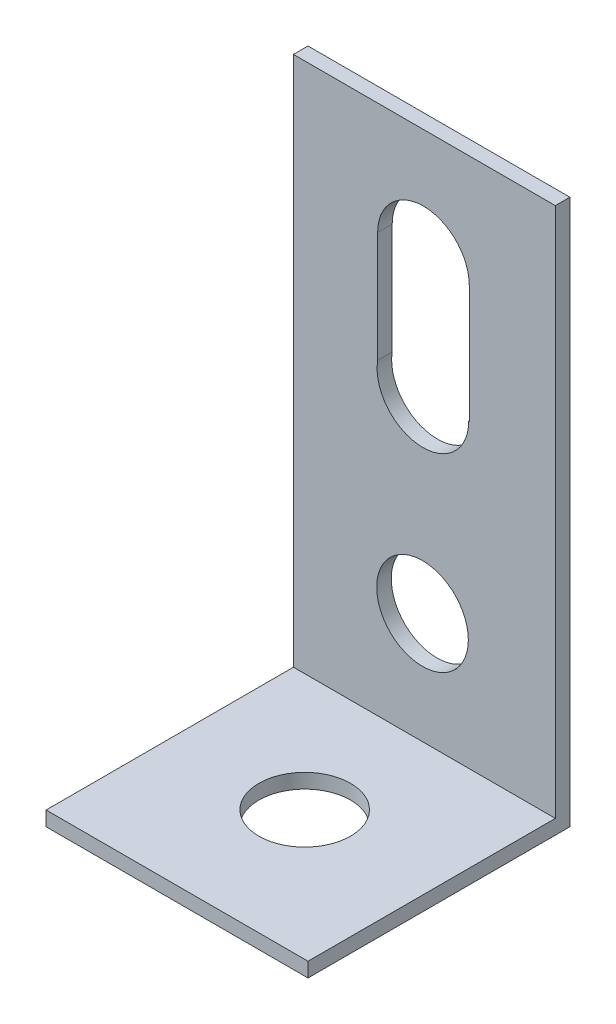
ISO-10303-21;
HEADER;
FILE_DESCRIPTION(('STEP AP214'),'2;1');
FILE_NAME('part.step','',(''),(''),'','','');
FILE_SCHEMA(('AUTOMOTIVE_DESIGN { 1 0 10303 214 1 1 1 1 }'));
ENDSEC;
DATA;
#1=APPLICATION_CONTEXT('core data for automotive mechanical design processes');
#2=APPLICATION_PROTOCOL_DEFINITION('international standard','automotive_design',2000,#1);
#3=PRODUCT_CONTEXT('',#1,'mechanical');
#4=PRODUCT('Part','Part','',(#3));
#5=PRODUCT_RELATED_PRODUCT_CATEGORY('part','',(#4));
#6=PRODUCT_DEFINITION_FORMATION('','',#4);
#7=PRODUCT_DEFINITION_CONTEXT('part definition',#1,'design');
#8=PRODUCT_DEFINITION('design','',#6,#7);
#9=PRODUCT_DEFINITION_SHAPE('','',#8);
#10=(LENGTH_UNIT() NAMED_UNIT(*) SI_UNIT(.MILLI.,.METRE.));
#11=(NAMED_UNIT(*) PLANE_ANGLE_UNIT() SI_UNIT($,.RADIAN.));
#12=(NAMED_UNIT(*) SI_UNIT($,.STERADIAN.) SOLID_ANGLE_UNIT());
#13=UNCERTAINTY_MEASURE_WITH_UNIT(LENGTH_MEASURE(1.E-05),#10,'distance_accuracy_value','');
#14=(GEOMETRIC_REPRESENTATION_CONTEXT(3) GLOBAL_UNCERTAINTY_ASSIGNED_CONTEXT((#13)) GLOBAL_UNIT_ASSIGNED_CONTEXT((#10,
#11,#12)) REPRESENTATION_CONTEXT('',''));
#15=CARTESIAN_POINT('',(0.,0.,0.));
#16=DIRECTION('',(0.,0.,1.));
#17=DIRECTION('',(1.,0.,0.));
#18=AXIS2_PLACEMENT_3D('',#15,#16,#17);
#19=CARTESIAN_POINT('',(24.3486309030817,2.667,23.7425931641171));
#20=DIRECTION('',(-1.,0.,0.));
#21=DIRECTION('',(0.,0.,1.));
#22=AXIS2_PLACEMENT_3D('',#19,#20,#21);
#23=PLANE('',#22);
#24=DIRECTION('',(0.,0.,-1.));
#25=VECTOR('',#24,1.);
#26=CARTESIAN_POINT('',(24.3486309030817,0.,23.7425931641171));
#27=LINE('',#26,#25);
#28=CARTESIAN_POINT('',(24.3486309030817,0.,23.7425931641171));
#29=VERTEX_POINT('',#28);
#30=CARTESIAN_POINT('',(24.3486309030817,0.,-24.2634068358829));
#31=VERTEX_POINT('',#30);
#32=EDGE_CURVE('E191',#29,#31,#27,.T.);
#33=ORIENTED_EDGE('',*,*,#32,.T.);
#34=DIRECTION('',(0.,-1.,0.));
#35=VECTOR('',#34,1.);
#36=CARTESIAN_POINT('',(24.3486309030817,2.667,-24.2634068358829));
#37=LINE('',#36,#35);
#38=CARTESIAN_POINT('',(24.3486309030817,99.9453824938809,-24.2634068358829));
#39=VERTEX_POINT('',#38);
#40=EDGE_CURVE('E11',#39,#31,#37,.T.);
#41=ORIENTED_EDGE('',*,*,#40,.F.);
#42=DIRECTION('',(0.,0.,1.));
#43=VECTOR('',#42,1.);
#44=CARTESIAN_POINT('',(24.3486309030817,99.9453824938809,-24.2634068358829));
#45=LINE('',#44,#43);
#46=CARTESIAN_POINT('',(24.3486309030817,99.9453824938809,-21.5964068358829));
#47=VERTEX_POINT('',#46);
#48=EDGE_CURVE('E177',#39,#47,#45,.T.);
#49=ORIENTED_EDGE('',*,*,#48,.T.);
#50=DIRECTION('',(0.,-1.,0.));
#51=VECTOR('',#50,1.);
#52=CARTESIAN_POINT('',(24.3486309030817,99.9453824938809,-21.5964068358829));
#53=LINE('',#52,#51);
#54=CARTESIAN_POINT('',(24.3486309030817,2.667,-21.5964068358829));
#55=VERTEX_POINT('',#54);
#56=EDGE_CURVE('E183',#47,#55,#53,.T.);
#57=ORIENTED_EDGE('',*,*,#56,.T.);
#58=DIRECTION('',(0.,0.,-1.));
#59=VECTOR('',#58,1.);
#60=CARTESIAN_POINT('',(24.3486309030817,2.667,23.7425931641171));
#61=LINE('',#60,#59);
#62=CARTESIAN_POINT('',(24.3486309030817,2.667,23.7425931641171));
#63=VERTEX_POINT('',#62);
#64=EDGE_CURVE('E192',#63,#55,#61,.T.);
#65=ORIENTED_EDGE('',*,*,#64,.F.);
#66=DIRECTION('',(0.,-1.,0.));
#67=VECTOR('',#66,1.);
#68=CARTESIAN_POINT('',(24.3486309030817,2.667,23.7425931641171));
#69=LINE('',#68,#67);
#70=EDGE_CURVE('E199',#63,#29,#69,.T.);
#71=ORIENTED_EDGE('',*,*,#70,.T.);
#72=EDGE_LOOP('',(#33,#41,#49,#57,#65,#71));
#73=FACE_BOUND('',#72,.T.);
#74=ADVANCED_FACE('F33',(#73),#23,.F.);
#75=CARTESIAN_POINT('',(-23.6573690969183,2.667,-24.2634068358829));
#76=DIRECTION('',(0.,0.,1.));
#77=DIRECTION('',(1.,0.,0.));
#78=AXIS2_PLACEMENT_3D('',#75,#76,#77);
#79=PLANE('',#78);
#80=DIRECTION('',(0.,-1.,0.));
#81=VECTOR('',#80,1.);
#82=CARTESIAN_POINT('',(-8.22665399711947,2.667,-24.2634068358829));
#83=LINE('',#82,#81);
#84=CARTESIAN_POINT('',(-8.22665399711947,79.3789935221233,-24.2634068358829));
#85=VERTEX_POINT('',#84);
#86=CARTESIAN_POINT('',(-8.22665399711947,59.0966838597933,-24.2634068358829));
#87=VERTEX_POINT('',#86);
#88=EDGE_CURVE('E162',#85,#87,#83,.T.);
#89=ORIENTED_EDGE('',*,*,#88,.T.);
#90=CARTESIAN_POINT('',(0.072763374307272,57.8006625270753,-24.2634068358829));
#91=DIRECTION('',(0.,0.,1.));
#92=DIRECTION('',(1.,0.,0.));
#93=AXIS2_PLACEMENT_3D('',#90,#91,#92);
#94=CIRCLE('',#93,8.4);
#95=CARTESIAN_POINT('',(8.47276337430727,57.8006625270753,-24.2634068358829));
#96=VERTEX_POINT('',#95);
#97=EDGE_CURVE('E165',#87,#96,#94,.T.);
#98=ORIENTED_EDGE('',*,*,#97,.T.);
#99=DIRECTION('',(1.,0.,0.));
#100=VECTOR('',#99,1.);
#101=CARTESIAN_POINT('',(-23.6573690969183,57.8006625270753,-24.2634068358829));
#102=LINE('',#101,#100);
#103=CARTESIAN_POINT('',(8.57334600288054,57.8006625270753,-24.2634068358829));
#104=VERTEX_POINT('',#103);
#105=EDGE_CURVE('E156',#96,#104,#102,.T.);
#106=ORIENTED_EDGE('',*,*,#105,.T.);
#107=DIRECTION('',(0.,1.,0.));
#108=VECTOR('',#107,1.);
#109=CARTESIAN_POINT('',(8.57334600288054,2.667,-24.2634068358829));
#110=LINE('',#109,#108);
#111=CARTESIAN_POINT('',(8.57334600288054,79.3789935221233,-24.2634068358829));
#112=VERTEX_POINT('',#111);
#113=EDGE_CURVE('E122',#104,#112,#110,.T.);
#114=ORIENTED_EDGE('',*,*,#113,.T.);
#115=CARTESIAN_POINT('',(0.173346002880533,79.3789935221233,-24.2634068358829));
#116=DIRECTION('',(0.,0.,1.));
#117=DIRECTION('',(1.,0.,0.));
#118=AXIS2_PLACEMENT_3D('',#115,#116,#117);
#119=CIRCLE('',#118,8.40000000000002);
#120=EDGE_CURVE('E159',#112,#85,#119,.T.);
#121=ORIENTED_EDGE('',*,*,#120,.T.);
#122=EDGE_LOOP('',(#89,#98,#106,#114,#121));
#123=FACE_BOUND('',#122,.T.);
#124=CARTESIAN_POINT('',(0.,23.0200154900135,-24.2634068358829));
#125=DIRECTION('',(0.,0.,1.));
#126=DIRECTION('',(1.,0.,0.));
#127=AXIS2_PLACEMENT_3D('',#124,#125,#126);
#128=CIRCLE('',#127,8.4);
#129=CARTESIAN_POINT('',(8.4,23.0200154900135,-24.2634068358829));
#130=VERTEX_POINT('',#129);
#131=EDGE_CURVE('E146',#130,#130,#128,.T.);
#132=ORIENTED_EDGE('',*,*,#131,.T.);
#133=EDGE_LOOP('',(#132));
#134=FACE_BOUND('',#133,.T.);
#135=DIRECTION('',(-1.,0.,0.));
#136=VECTOR('',#135,1.);
#137=CARTESIAN_POINT('',(-23.6573690969183,0.,-24.2634068358829));
#138=LINE('',#137,#136);
#139=CARTESIAN_POINT('',(-23.6573690969183,0.,-24.2634068358829));
#140=VERTEX_POINT('',#139);
#141=EDGE_CURVE('E201',#31,#140,#138,.T.);
#142=ORIENTED_EDGE('',*,*,#141,.T.);
#143=DIRECTION('',(0.,-1.,0.));
#144=VECTOR('',#143,1.);
#145=CARTESIAN_POINT('',(-23.6573690969183,2.667,-24.2634068358829));
#146=LINE('',#145,#144);
#147=CARTESIAN_POINT('',(-23.6573690969183,99.9453824938809,-24.2634068358829));
#148=VERTEX_POINT('',#147);
#149=EDGE_CURVE('E41',#148,#140,#146,.T.);
#150=ORIENTED_EDGE('',*,*,#149,.F.);
#151=DIRECTION('',(1.,0.,0.));
#152=VECTOR('',#151,1.);
#153=CARTESIAN_POINT('',(-23.6573690969183,99.9453824938809,-24.2634068358829));
#154=LINE('',#153,#152);
#155=EDGE_CURVE('E174',#148,#39,#154,.T.);
#156=ORIENTED_EDGE('',*,*,#155,.T.);
#157=ORIENTED_EDGE('',*,*,#40,.T.);
#158=EDGE_LOOP('',(#142,#150,#156,#157));
#159=FACE_BOUND('',#158,.T.);
#160=ADVANCED_FACE('F239',(#123,#134,#159),#79,.F.);
#161=CARTESIAN_POINT('',(-23.6573690969183,2.667,23.7425931641171));
#162=DIRECTION('',(1.,0.,0.));
#163=DIRECTION('',(0.,0.,-1.));
#164=AXIS2_PLACEMENT_3D('',#161,#162,#163);
#165=PLANE('',#164);
#166=DIRECTION('',(0.,0.,1.));
#167=VECTOR('',#166,1.);
#168=CARTESIAN_POINT('',(-23.6573690969183,2.667,23.7425931641171));
#169=LINE('',#168,#167);
#170=CARTESIAN_POINT('',(-23.6573690969183,2.667,-21.5964068358829));
#171=VERTEX_POINT('',#170);
#172=CARTESIAN_POINT('',(-23.6573690969183,2.667,23.7425931641171));
#173=VERTEX_POINT('',#172);
#174=EDGE_CURVE('E194',#171,#173,#169,.T.);
#175=ORIENTED_EDGE('',*,*,#174,.F.);
#176=DIRECTION('',(0.,-1.,0.));
#177=VECTOR('',#176,1.);
#178=CARTESIAN_POINT('',(-23.6573690969183,99.9453824938809,-21.5964068358829));
#179=LINE('',#178,#177);
#180=CARTESIAN_POINT('',(-23.6573690969183,99.9453824938809,-21.5964068358829));
#181=VERTEX_POINT('',#180);
#182=EDGE_CURVE('E184',#181,#171,#179,.T.);
#183=ORIENTED_EDGE('',*,*,#182,.F.);
#184=DIRECTION('',(0.,0.,-1.));
#185=VECTOR('',#184,1.);
#186=CARTESIAN_POINT('',(-23.6573690969183,99.9453824938809,-24.2634068358829));
#187=LINE('',#186,#185);
#188=EDGE_CURVE('E171',#181,#148,#187,.T.);
#189=ORIENTED_EDGE('',*,*,#188,.T.);
#190=ORIENTED_EDGE('',*,*,#149,.T.);
#191=DIRECTION('',(0.,0.,1.));
#192=VECTOR('',#191,1.);
#193=CARTESIAN_POINT('',(-23.6573690969183,0.,23.7425931641171));
#194=LINE('',#193,#192);
#195=CARTESIAN_POINT('',(-23.6573690969183,0.,23.7425931641171));
#196=VERTEX_POINT('',#195);
#197=EDGE_CURVE('E203',#140,#196,#194,.T.);
#198=ORIENTED_EDGE('',*,*,#197,.T.);
#199=DIRECTION('',(0.,-1.,0.));
#200=VECTOR('',#199,1.);
#201=CARTESIAN_POINT('',(-23.6573690969183,2.667,23.7425931641171));
#202=LINE('',#201,#200);
#203=EDGE_CURVE('E208',#173,#196,#202,.T.);
#204=ORIENTED_EDGE('',*,*,#203,.F.);
#205=EDGE_LOOP('',(#175,#183,#189,#190,#198,#204));
#206=FACE_BOUND('',#205,.T.);
#207=ADVANCED_FACE('F215',(#206),#165,.F.);
#208=CARTESIAN_POINT('',(-23.6573690969183,2.667,23.7425931641171));
#209=DIRECTION('',(0.,0.,-1.));
#210=DIRECTION('',(-1.,0.,0.));
#211=AXIS2_PLACEMENT_3D('',#208,#209,#210);
#212=PLANE('',#211);
#213=DIRECTION('',(1.,0.,0.));
#214=VECTOR('',#213,1.);
#215=CARTESIAN_POINT('',(-23.6573690969183,0.,23.7425931641171));
#216=LINE('',#215,#214);
#217=EDGE_CURVE('E195',#196,#29,#216,.T.);
#218=ORIENTED_EDGE('',*,*,#217,.T.);
#219=ORIENTED_EDGE('',*,*,#70,.F.);
#220=DIRECTION('',(1.,0.,0.));
#221=VECTOR('',#220,1.);
#222=CARTESIAN_POINT('',(-23.6573690969183,2.667,23.7425931641171));
#223=LINE('',#222,#221);
#224=EDGE_CURVE('E197',#173,#63,#223,.T.);
#225=ORIENTED_EDGE('',*,*,#224,.F.);
#226=ORIENTED_EDGE('',*,*,#203,.T.);
#227=EDGE_LOOP('',(#218,#219,#225,#226));
#228=FACE_BOUND('',#227,.T.);
#229=ADVANCED_FACE('F227',(#228),#212,.F.);
#230=CARTESIAN_POINT('',(0.,2.667,0.));
#231=DIRECTION('',(0.,-1.,0.));
#232=DIRECTION('',(0.,0.,-1.));
#233=AXIS2_PLACEMENT_3D('',#230,#231,#232);
#234=PLANE('',#233);
#235=CARTESIAN_POINT('',(0.,2.667,0.));
#236=DIRECTION('',(0.,1.,0.));
#237=DIRECTION('',(0.,0.,1.));
#238=AXIS2_PLACEMENT_3D('',#235,#236,#237);
#239=CIRCLE('',#238,8.4);
#240=CARTESIAN_POINT('',(0.,2.667,8.4));
#241=VERTEX_POINT('',#240);
#242=EDGE_CURVE('E168',#241,#241,#239,.T.);
#243=ORIENTED_EDGE('',*,*,#242,.F.);
#244=EDGE_LOOP('',(#243));
#245=FACE_BOUND('',#244,.T.);
#246=ORIENTED_EDGE('',*,*,#64,.T.);
#247=DIRECTION('',(-1.,0.,0.));
#248=VECTOR('',#247,1.);
#249=CARTESIAN_POINT('',(0.,2.667,-21.5964068358829));
#250=LINE('',#249,#248);
#251=EDGE_CURVE('E187',#55,#171,#250,.T.);
#252=ORIENTED_EDGE('',*,*,#251,.T.);
#253=ORIENTED_EDGE('',*,*,#174,.T.);
#254=ORIENTED_EDGE('',*,*,#224,.T.);
#255=EDGE_LOOP('',(#246,#252,#253,#254));
#256=FACE_BOUND('',#255,.T.);
#257=ADVANCED_FACE('F233',(#245,#256),#234,.F.);
#258=CARTESIAN_POINT('',(0.,0.,0.));
#259=DIRECTION('',(0.,-1.,0.));
#260=DIRECTION('',(0.,0.,-1.));
#261=AXIS2_PLACEMENT_3D('',#258,#259,#260);
#262=PLANE('',#261);
#263=CARTESIAN_POINT('',(0.,0.,0.));
#264=DIRECTION('',(0.,-1.,0.));
#265=DIRECTION('',(0.,0.,-1.));
#266=AXIS2_PLACEMENT_3D('',#263,#264,#265);
#267=CIRCLE('',#266,8.4);
#268=CARTESIAN_POINT('',(0.,0.,-8.4));
#269=VERTEX_POINT('',#268);
#270=EDGE_CURVE('E36',#269,#269,#267,.T.);
#271=ORIENTED_EDGE('',*,*,#270,.F.);
#272=EDGE_LOOP('',(#271));
#273=FACE_BOUND('',#272,.T.);
#274=ORIENTED_EDGE('',*,*,#217,.F.);
#275=ORIENTED_EDGE('',*,*,#197,.F.);
#276=ORIENTED_EDGE('',*,*,#141,.F.);
#277=ORIENTED_EDGE('',*,*,#32,.F.);
#278=EDGE_LOOP('',(#274,#275,#276,#277));
#279=FACE_BOUND('',#278,.T.);
#280=ADVANCED_FACE('F223',(#273,#279),#262,.T.);
#281=CARTESIAN_POINT('',(-23.6573690969183,99.9453824938809,-21.5964068358829));
#282=DIRECTION('',(0.,0.,1.));
#283=DIRECTION('',(1.,0.,0.));
#284=AXIS2_PLACEMENT_3D('',#281,#282,#283);
#285=PLANE('',#284);
#286=CARTESIAN_POINT('',(0.072763374307272,57.8006625270753,-21.5964068358829));
#287=DIRECTION('',(0.,0.,1.));
#288=DIRECTION('',(1.,0.,0.));
#289=AXIS2_PLACEMENT_3D('',#286,#287,#288);
#290=CIRCLE('',#289,8.4);
#291=CARTESIAN_POINT('',(-8.22665399711947,59.0966838597933,-21.5964068358829));
#292=VERTEX_POINT('',#291);
#293=CARTESIAN_POINT('',(8.47276337430727,57.8006625270753,-21.5964068358829));
#294=VERTEX_POINT('',#293);
#295=EDGE_CURVE('E56',#292,#294,#290,.T.);
#296=ORIENTED_EDGE('',*,*,#295,.F.);
#297=DIRECTION('',(0.,-1.,0.));
#298=VECTOR('',#297,1.);
#299=CARTESIAN_POINT('',(-8.22665399711947,0.,-21.5964068358829));
#300=LINE('',#299,#298);
#301=CARTESIAN_POINT('',(-8.22665399711947,79.3789935221233,-21.5964068358829));
#302=VERTEX_POINT('',#301);
#303=EDGE_CURVE('E138',#302,#292,#300,.T.);
#304=ORIENTED_EDGE('',*,*,#303,.F.);
#305=CARTESIAN_POINT('',(0.173346002880533,79.3789935221233,-21.5964068358829));
#306=DIRECTION('',(0.,0.,1.));
#307=DIRECTION('',(1.,0.,0.));
#308=AXIS2_PLACEMENT_3D('',#305,#306,#307);
#309=CIRCLE('',#308,8.40000000000002);
#310=CARTESIAN_POINT('',(8.57334600288054,79.3789935221233,-21.5964068358829));
#311=VERTEX_POINT('',#310);
#312=EDGE_CURVE('E136',#311,#302,#309,.T.);
#313=ORIENTED_EDGE('',*,*,#312,.F.);
#314=DIRECTION('',(0.,1.,0.));
#315=VECTOR('',#314,1.);
#316=CARTESIAN_POINT('',(8.57334600288054,0.,-21.5964068358829));
#317=LINE('',#316,#315);
#318=CARTESIAN_POINT('',(8.57334600288054,57.8006625270753,-21.5964068358829));
#319=VERTEX_POINT('',#318);
#320=EDGE_CURVE('E119',#319,#311,#317,.T.);
#321=ORIENTED_EDGE('',*,*,#320,.F.);
#322=DIRECTION('',(1.,0.,0.));
#323=VECTOR('',#322,1.);
#324=CARTESIAN_POINT('',(0.,57.8006625270753,-21.5964068358829));
#325=LINE('',#324,#323);
#326=EDGE_CURVE('E128',#294,#319,#325,.T.);
#327=ORIENTED_EDGE('',*,*,#326,.F.);
#328=EDGE_LOOP('',(#296,#304,#313,#321,#327));
#329=FACE_BOUND('',#328,.T.);
#330=CARTESIAN_POINT('',(0.,23.0200154900135,-21.5964068358829));
#331=DIRECTION('',(0.,0.,1.));
#332=DIRECTION('',(1.,0.,0.));
#333=AXIS2_PLACEMENT_3D('',#330,#331,#332);
#334=CIRCLE('',#333,8.4);
#335=CARTESIAN_POINT('',(8.4,23.0200154900135,-21.5964068358829));
#336=VERTEX_POINT('',#335);
#337=EDGE_CURVE('E151',#336,#336,#334,.T.);
#338=ORIENTED_EDGE('',*,*,#337,.F.);
#339=EDGE_LOOP('',(#338));
#340=FACE_BOUND('',#339,.T.);
#341=ORIENTED_EDGE('',*,*,#251,.F.);
#342=ORIENTED_EDGE('',*,*,#56,.F.);
#343=DIRECTION('',(-1.,0.,0.));
#344=VECTOR('',#343,1.);
#345=CARTESIAN_POINT('',(-23.6573690969183,99.9453824938809,-21.5964068358829));
#346=LINE('',#345,#344);
#347=EDGE_CURVE('E180',#47,#181,#346,.T.);
#348=ORIENTED_EDGE('',*,*,#347,.T.);
#349=ORIENTED_EDGE('',*,*,#182,.T.);
#350=EDGE_LOOP('',(#341,#342,#348,#349));
#351=FACE_BOUND('',#350,.T.);
#352=ADVANCED_FACE('F132',(#329,#340,#351),#285,.T.);
#353=CARTESIAN_POINT('',(0.,99.9453824938809,0.));
#354=DIRECTION('',(0.,1.,0.));
#355=DIRECTION('',(0.,0.,1.));
#356=AXIS2_PLACEMENT_3D('',#353,#354,#355);
#357=PLANE('',#356);
#358=ORIENTED_EDGE('',*,*,#188,.F.);
#359=ORIENTED_EDGE('',*,*,#347,.F.);
#360=ORIENTED_EDGE('',*,*,#48,.F.);
#361=ORIENTED_EDGE('',*,*,#155,.F.);
#362=EDGE_LOOP('',(#358,#359,#360,#361));
#363=FACE_BOUND('',#362,.T.);
#364=ADVANCED_FACE('F237',(#363),#357,.T.);
#365=CARTESIAN_POINT('',(0.,-18.333,0.));
#366=DIRECTION('',(0.,1.,0.));
#367=DIRECTION('',(0.,0.,1.));
#368=AXIS2_PLACEMENT_3D('',#365,#366,#367);
#369=CYLINDRICAL_SURFACE('',#368,8.4);
#370=ORIENTED_EDGE('',*,*,#270,.T.);
#371=EDGE_LOOP('',(#370));
#372=FACE_BOUND('',#371,.T.);
#373=ORIENTED_EDGE('',*,*,#242,.T.);
#374=EDGE_LOOP('',(#373));
#375=FACE_BOUND('',#374,.T.);
#376=ADVANCED_FACE('F261',(#372,#375),#369,.F.);
#377=CARTESIAN_POINT('',(0.,23.0200154900135,-26.9304068358829));
#378=DIRECTION('',(0.,0.,1.));
#379=DIRECTION('',(1.,0.,0.));
#380=AXIS2_PLACEMENT_3D('',#377,#378,#379);
#381=CYLINDRICAL_SURFACE('',#380,8.4);
#382=ORIENTED_EDGE('',*,*,#337,.T.);
#383=EDGE_LOOP('',(#382));
#384=FACE_BOUND('',#383,.T.);
#385=ORIENTED_EDGE('',*,*,#131,.F.);
#386=EDGE_LOOP('',(#385));
#387=FACE_BOUND('',#386,.T.);
#388=ADVANCED_FACE('F264',(#384,#387),#381,.F.);
#389=CARTESIAN_POINT('',(0.072763374307272,57.8006625270753,-26.9304068358829));
#390=DIRECTION('',(0.,0.,1.));
#391=DIRECTION('',(1.,0.,0.));
#392=AXIS2_PLACEMENT_3D('',#389,#390,#391);
#393=CYLINDRICAL_SURFACE('',#392,8.4);
#394=DIRECTION('',(0.,0.,1.));
#395=VECTOR('',#394,1.);
#396=CARTESIAN_POINT('',(-8.22665399711947,59.0966838597933,-26.9304068358829));
#397=LINE('',#396,#395);
#398=EDGE_CURVE('E144',#87,#292,#397,.T.);
#399=ORIENTED_EDGE('',*,*,#398,.T.);
#400=ORIENTED_EDGE('',*,*,#295,.T.);
#401=DIRECTION('',(0.,0.,1.));
#402=VECTOR('',#401,1.);
#403=CARTESIAN_POINT('',(8.47276337430727,57.8006625270753,-26.9304068358829));
#404=LINE('',#403,#402);
#405=EDGE_CURVE('E125',#96,#294,#404,.T.);
#406=ORIENTED_EDGE('',*,*,#405,.F.);
#407=ORIENTED_EDGE('',*,*,#97,.F.);
#408=EDGE_LOOP('',(#399,#400,#406,#407));
#409=FACE_BOUND('',#408,.T.);
#410=ADVANCED_FACE('F268',(#409),#393,.F.);
#411=CARTESIAN_POINT('',(-8.22665399711947,0.,-26.9304068358829));
#412=DIRECTION('',(-1.,0.,0.));
#413=DIRECTION('',(0.,0.,1.));
#414=AXIS2_PLACEMENT_3D('',#411,#412,#413);
#415=PLANE('',#414);
#416=DIRECTION('',(0.,0.,1.));
#417=VECTOR('',#416,1.);
#418=CARTESIAN_POINT('',(-8.22665399711947,79.3789935221233,-26.9304068358829));
#419=LINE('',#418,#417);
#420=EDGE_CURVE('E147',#85,#302,#419,.T.);
#421=ORIENTED_EDGE('',*,*,#420,.T.);
#422=ORIENTED_EDGE('',*,*,#303,.T.);
#423=ORIENTED_EDGE('',*,*,#398,.F.);
#424=ORIENTED_EDGE('',*,*,#88,.F.);
#425=EDGE_LOOP('',(#421,#422,#423,#424));
#426=FACE_BOUND('',#425,.T.);
#427=ADVANCED_FACE('F272',(#426),#415,.F.);
#428=CARTESIAN_POINT('',(0.173346002880533,79.3789935221233,-26.9304068358829));
#429=DIRECTION('',(0.,0.,1.));
#430=DIRECTION('',(1.,0.,0.));
#431=AXIS2_PLACEMENT_3D('',#428,#429,#430);
#432=CYLINDRICAL_SURFACE('',#431,8.40000000000002);
#433=DIRECTION('',(0.,0.,1.));
#434=VECTOR('',#433,1.);
#435=CARTESIAN_POINT('',(8.57334600288054,79.3789935221233,-26.9304068358829));
#436=LINE('',#435,#434);
#437=EDGE_CURVE('E124',#112,#311,#436,.T.);
#438=ORIENTED_EDGE('',*,*,#437,.T.);
#439=ORIENTED_EDGE('',*,*,#312,.T.);
#440=ORIENTED_EDGE('',*,*,#420,.F.);
#441=ORIENTED_EDGE('',*,*,#120,.F.);
#442=EDGE_LOOP('',(#438,#439,#440,#441));
#443=FACE_BOUND('',#442,.T.);
#444=ADVANCED_FACE('F277',(#443),#432,.F.);
#445=CARTESIAN_POINT('',(8.57334600288054,0.,-26.9304068358829));
#446=DIRECTION('',(1.,0.,0.));
#447=DIRECTION('',(0.,0.,-1.));
#448=AXIS2_PLACEMENT_3D('',#445,#446,#447);
#449=PLANE('',#448);
#450=DIRECTION('',(0.,0.,1.));
#451=VECTOR('',#450,1.);
#452=CARTESIAN_POINT('',(8.57334600288054,57.8006625270753,-26.9304068358829));
#453=LINE('',#452,#451);
#454=EDGE_CURVE('E48',#104,#319,#453,.T.);
#455=ORIENTED_EDGE('',*,*,#454,.T.);
#456=ORIENTED_EDGE('',*,*,#320,.T.);
#457=ORIENTED_EDGE('',*,*,#437,.F.);
#458=ORIENTED_EDGE('',*,*,#113,.F.);
#459=EDGE_LOOP('',(#455,#456,#457,#458));
#460=FACE_BOUND('',#459,.T.);
#461=ADVANCED_FACE('F116',(#460),#449,.F.);
#462=CARTESIAN_POINT('',(0.,57.8006625270753,-26.9304068358829));
#463=DIRECTION('',(0.,-1.,0.));
#464=DIRECTION('',(0.,0.,-1.));
#465=AXIS2_PLACEMENT_3D('',#462,#463,#464);
#466=PLANE('',#465);
#467=ORIENTED_EDGE('',*,*,#405,.T.);
#468=ORIENTED_EDGE('',*,*,#326,.T.);
#469=ORIENTED_EDGE('',*,*,#454,.F.);
#470=ORIENTED_EDGE('',*,*,#105,.F.);
#471=EDGE_LOOP('',(#467,#468,#469,#470));
#472=FACE_BOUND('',#471,.T.);
#473=ADVANCED_FACE('F129',(#472),#466,.F.);
#474=CLOSED_SHELL('',(#74,#160,#207,#229,#257,#280,#352,#364,#376,#388,#410,#427,#444,#461,#473));
#475=MANIFOLD_SOLID_BREP('B2',#474);
#476=ADVANCED_BREP_SHAPE_REPRESENTATION('',(#18,#475),#14);
#477=SHAPE_DEFINITION_REPRESENTATION(#9,#476);
ENDSEC;
END-ISO-10303-21;
